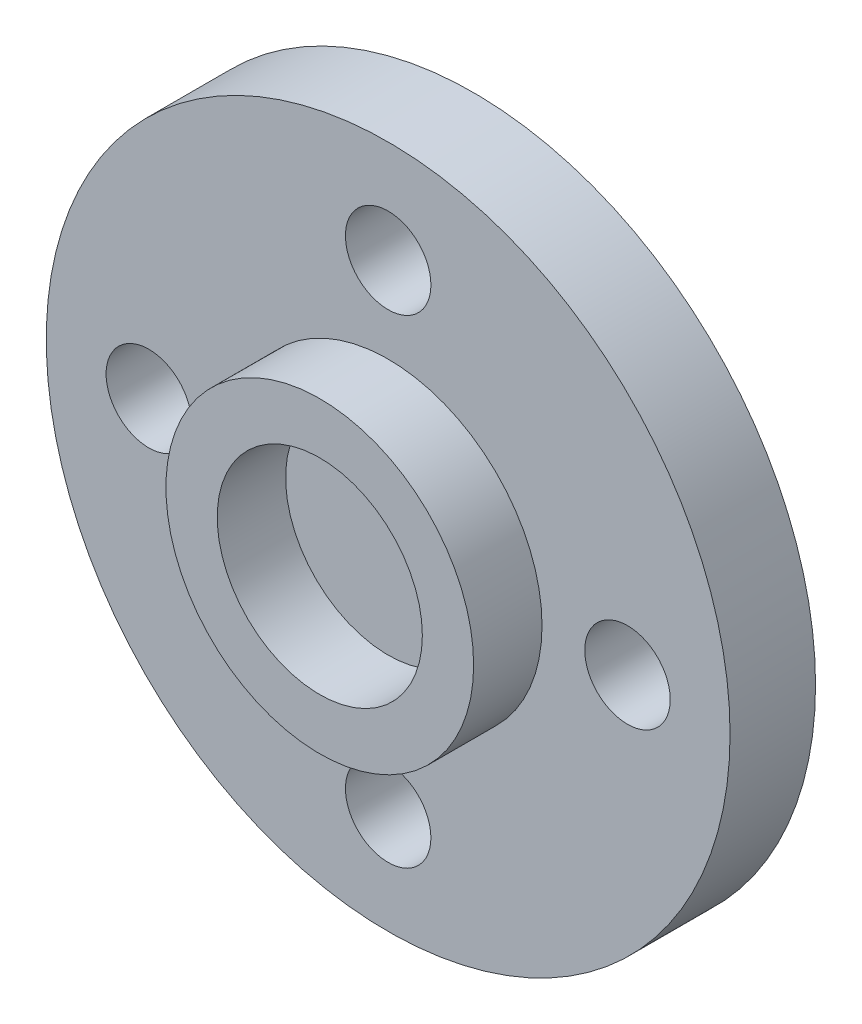
ISO-10303-21;
HEADER;
FILE_DESCRIPTION(('STEP AP214'),'2;1');
FILE_NAME('part.step','',(''),(''),'','','');
FILE_SCHEMA(('AUTOMOTIVE_DESIGN { 1 0 10303 214 1 1 1 1 }'));
ENDSEC;
DATA;
#1=APPLICATION_CONTEXT('core data for automotive mechanical design processes');
#2=APPLICATION_PROTOCOL_DEFINITION('international standard','automotive_design',2000,#1);
#3=PRODUCT_CONTEXT('',#1,'mechanical');
#4=PRODUCT('Part','Part','',(#3));
#5=PRODUCT_RELATED_PRODUCT_CATEGORY('part','',(#4));
#6=PRODUCT_DEFINITION_FORMATION('','',#4);
#7=PRODUCT_DEFINITION_CONTEXT('part definition',#1,'design');
#8=PRODUCT_DEFINITION('design','',#6,#7);
#9=PRODUCT_DEFINITION_SHAPE('','',#8);
#10=(LENGTH_UNIT() NAMED_UNIT(*) SI_UNIT(.MILLI.,.METRE.));
#11=(NAMED_UNIT(*) PLANE_ANGLE_UNIT() SI_UNIT($,.RADIAN.));
#12=(NAMED_UNIT(*) SI_UNIT($,.STERADIAN.) SOLID_ANGLE_UNIT());
#13=UNCERTAINTY_MEASURE_WITH_UNIT(LENGTH_MEASURE(1.E-05),#10,'distance_accuracy_value','');
#14=(GEOMETRIC_REPRESENTATION_CONTEXT(3) GLOBAL_UNCERTAINTY_ASSIGNED_CONTEXT((#13)) GLOBAL_UNIT_ASSIGNED_CONTEXT((#10,
#11,#12)) REPRESENTATION_CONTEXT('',''));
#15=CARTESIAN_POINT('',(0.,0.,0.));
#16=DIRECTION('',(0.,0.,1.));
#17=DIRECTION('',(1.,0.,0.));
#18=AXIS2_PLACEMENT_3D('',#15,#16,#17);
#19=CARTESIAN_POINT('',(0.,0.,2.5));
#20=DIRECTION('',(0.,0.,-1.));
#21=DIRECTION('',(-1.,0.,0.));
#22=AXIS2_PLACEMENT_3D('',#19,#20,#21);
#23=CYLINDRICAL_SURFACE('',#22,10.);
#24=CARTESIAN_POINT('',(0.,0.,2.5));
#25=DIRECTION('',(0.,0.,1.));
#26=DIRECTION('',(1.,0.,0.));
#27=AXIS2_PLACEMENT_3D('',#24,#25,#26);
#28=CIRCLE('',#27,10.);
#29=CARTESIAN_POINT('',(10.,0.,2.5));
#30=VERTEX_POINT('',#29);
#31=EDGE_CURVE('E50',#30,#30,#28,.T.);
#32=ORIENTED_EDGE('',*,*,#31,.F.);
#33=EDGE_LOOP('',(#32));
#34=FACE_BOUND('',#33,.T.);
#35=CARTESIAN_POINT('',(0.,0.,0.));
#36=DIRECTION('',(0.,0.,1.));
#37=DIRECTION('',(1.,0.,0.));
#38=AXIS2_PLACEMENT_3D('',#35,#36,#37);
#39=CIRCLE('',#38,10.);
#40=CARTESIAN_POINT('',(10.,0.,0.));
#41=VERTEX_POINT('',#40);
#42=EDGE_CURVE('E55',#41,#41,#39,.T.);
#43=ORIENTED_EDGE('',*,*,#42,.T.);
#44=EDGE_LOOP('',(#43));
#45=FACE_BOUND('',#44,.T.);
#46=ADVANCED_FACE('F43',(#34,#45),#23,.T.);
#47=CARTESIAN_POINT('',(0.,0.,2.5));
#48=DIRECTION('',(0.,0.,1.));
#49=DIRECTION('',(1.,0.,0.));
#50=AXIS2_PLACEMENT_3D('',#47,#48,#49);
#51=PLANE('',#50);
#52=CARTESIAN_POINT('',(0.,7.,2.5));
#53=DIRECTION('',(0.,0.,1.));
#54=DIRECTION('',(1.,0.,0.));
#55=AXIS2_PLACEMENT_3D('',#52,#53,#54);
#56=CIRCLE('',#55,1.25);
#57=CARTESIAN_POINT('',(1.25,7.,2.5));
#58=VERTEX_POINT('',#57);
#59=EDGE_CURVE('E99',#58,#58,#56,.T.);
#60=ORIENTED_EDGE('',*,*,#59,.F.);
#61=EDGE_LOOP('',(#60));
#62=FACE_BOUND('',#61,.T.);
#63=CARTESIAN_POINT('',(7.,0.,2.5));
#64=DIRECTION('',(0.,0.,1.));
#65=DIRECTION('',(1.,0.,0.));
#66=AXIS2_PLACEMENT_3D('',#63,#64,#65);
#67=CIRCLE('',#66,1.25);
#68=CARTESIAN_POINT('',(8.25,0.,2.5));
#69=VERTEX_POINT('',#68);
#70=EDGE_CURVE('E95',#69,#69,#67,.T.);
#71=ORIENTED_EDGE('',*,*,#70,.F.);
#72=EDGE_LOOP('',(#71));
#73=FACE_BOUND('',#72,.T.);
#74=CARTESIAN_POINT('',(0.,-7.,2.5));
#75=DIRECTION('',(0.,0.,1.));
#76=DIRECTION('',(1.,0.,0.));
#77=AXIS2_PLACEMENT_3D('',#74,#75,#76);
#78=CIRCLE('',#77,1.25);
#79=CARTESIAN_POINT('',(1.24999999999995,-7.,2.5));
#80=VERTEX_POINT('',#79);
#81=EDGE_CURVE('E87',#80,#80,#78,.T.);
#82=ORIENTED_EDGE('',*,*,#81,.F.);
#83=EDGE_LOOP('',(#82));
#84=FACE_BOUND('',#83,.T.);
#85=CARTESIAN_POINT('',(-7.,0.,2.5));
#86=DIRECTION('',(0.,0.,1.));
#87=DIRECTION('',(1.,0.,0.));
#88=AXIS2_PLACEMENT_3D('',#85,#86,#87);
#89=CIRCLE('',#88,1.25);
#90=CARTESIAN_POINT('',(-5.75,0.,2.5));
#91=VERTEX_POINT('',#90);
#92=EDGE_CURVE('E79',#91,#91,#89,.T.);
#93=ORIENTED_EDGE('',*,*,#92,.F.);
#94=EDGE_LOOP('',(#93));
#95=FACE_BOUND('',#94,.T.);
#96=CARTESIAN_POINT('',(0.,0.,2.5));
#97=DIRECTION('',(0.,0.,1.));
#98=DIRECTION('',(1.,0.,0.));
#99=AXIS2_PLACEMENT_3D('',#96,#97,#98);
#100=CIRCLE('',#99,4.5);
#101=CARTESIAN_POINT('',(4.5,0.,2.5));
#102=VERTEX_POINT('',#101);
#103=EDGE_CURVE('E63',#102,#102,#100,.T.);
#104=ORIENTED_EDGE('',*,*,#103,.F.);
#105=EDGE_LOOP('',(#104));
#106=FACE_BOUND('',#105,.T.);
#107=ORIENTED_EDGE('',*,*,#31,.T.);
#108=EDGE_LOOP('',(#107));
#109=FACE_BOUND('',#108,.T.);
#110=ADVANCED_FACE('F117',(#62,#73,#84,#95,#106,#109),#51,.T.);
#111=CARTESIAN_POINT('',(0.,0.,0.));
#112=DIRECTION('',(0.,0.,1.));
#113=DIRECTION('',(1.,0.,0.));
#114=AXIS2_PLACEMENT_3D('',#111,#112,#113);
#115=PLANE('',#114);
#116=CARTESIAN_POINT('',(0.,7.,0.));
#117=DIRECTION('',(0.,0.,1.));
#118=DIRECTION('',(1.,0.,0.));
#119=AXIS2_PLACEMENT_3D('',#116,#117,#118);
#120=CIRCLE('',#119,1.25);
#121=CARTESIAN_POINT('',(1.25,7.,0.));
#122=VERTEX_POINT('',#121);
#123=EDGE_CURVE('E74',#122,#122,#120,.T.);
#124=ORIENTED_EDGE('',*,*,#123,.T.);
#125=EDGE_LOOP('',(#124));
#126=FACE_BOUND('',#125,.T.);
#127=CARTESIAN_POINT('',(7.,0.,0.));
#128=DIRECTION('',(0.,0.,1.));
#129=DIRECTION('',(1.,0.,0.));
#130=AXIS2_PLACEMENT_3D('',#127,#128,#129);
#131=CIRCLE('',#130,1.25);
#132=CARTESIAN_POINT('',(8.25,0.,0.));
#133=VERTEX_POINT('',#132);
#134=EDGE_CURVE('E91',#133,#133,#131,.T.);
#135=ORIENTED_EDGE('',*,*,#134,.T.);
#136=EDGE_LOOP('',(#135));
#137=FACE_BOUND('',#136,.T.);
#138=CARTESIAN_POINT('',(0.,-7.,0.));
#139=DIRECTION('',(0.,0.,1.));
#140=DIRECTION('',(1.,0.,0.));
#141=AXIS2_PLACEMENT_3D('',#138,#139,#140);
#142=CIRCLE('',#141,1.25);
#143=CARTESIAN_POINT('',(1.24999999999995,-7.,0.));
#144=VERTEX_POINT('',#143);
#145=EDGE_CURVE('E83',#144,#144,#142,.T.);
#146=ORIENTED_EDGE('',*,*,#145,.T.);
#147=EDGE_LOOP('',(#146));
#148=FACE_BOUND('',#147,.T.);
#149=CARTESIAN_POINT('',(-7.,0.,0.));
#150=DIRECTION('',(0.,0.,1.));
#151=DIRECTION('',(1.,0.,0.));
#152=AXIS2_PLACEMENT_3D('',#149,#150,#151);
#153=CIRCLE('',#152,1.25);
#154=CARTESIAN_POINT('',(-5.75,0.,0.));
#155=VERTEX_POINT('',#154);
#156=EDGE_CURVE('E75',#155,#155,#153,.T.);
#157=ORIENTED_EDGE('',*,*,#156,.T.);
#158=EDGE_LOOP('',(#157));
#159=FACE_BOUND('',#158,.T.);
#160=ORIENTED_EDGE('',*,*,#42,.F.);
#161=EDGE_LOOP('',(#160));
#162=FACE_BOUND('',#161,.T.);
#163=ADVANCED_FACE('F107',(#126,#137,#148,#159,#162),#115,.F.);
#164=CARTESIAN_POINT('',(0.,0.,4.5));
#165=DIRECTION('',(0.,0.,1.));
#166=DIRECTION('',(1.,0.,0.));
#167=AXIS2_PLACEMENT_3D('',#164,#165,#166);
#168=PLANE('',#167);
#169=CARTESIAN_POINT('',(0.,0.,4.5));
#170=DIRECTION('',(0.,0.,1.));
#171=DIRECTION('',(1.,0.,0.));
#172=AXIS2_PLACEMENT_3D('',#169,#170,#171);
#173=CIRCLE('',#172,4.5);
#174=CARTESIAN_POINT('',(4.5,0.,4.5));
#175=VERTEX_POINT('',#174);
#176=EDGE_CURVE('E61',#175,#175,#173,.T.);
#177=ORIENTED_EDGE('',*,*,#176,.T.);
#178=EDGE_LOOP('',(#177));
#179=FACE_BOUND('',#178,.T.);
#180=CARTESIAN_POINT('',(0.,0.,4.5));
#181=DIRECTION('',(0.,0.,1.));
#182=DIRECTION('',(1.,0.,0.));
#183=AXIS2_PLACEMENT_3D('',#180,#181,#182);
#184=CIRCLE('',#183,3.);
#185=CARTESIAN_POINT('',(3.,0.,4.5));
#186=VERTEX_POINT('',#185);
#187=EDGE_CURVE('E67',#186,#186,#184,.T.);
#188=ORIENTED_EDGE('',*,*,#187,.F.);
#189=EDGE_LOOP('',(#188));
#190=FACE_BOUND('',#189,.T.);
#191=ADVANCED_FACE('F133',(#179,#190),#168,.T.);
#192=CARTESIAN_POINT('',(0.,0.,4.5));
#193=DIRECTION('',(0.,0.,-1.));
#194=DIRECTION('',(-1.,0.,0.));
#195=AXIS2_PLACEMENT_3D('',#192,#193,#194);
#196=CYLINDRICAL_SURFACE('',#195,4.5);
#197=ORIENTED_EDGE('',*,*,#176,.F.);
#198=EDGE_LOOP('',(#197));
#199=FACE_BOUND('',#198,.T.);
#200=ORIENTED_EDGE('',*,*,#103,.T.);
#201=EDGE_LOOP('',(#200));
#202=FACE_BOUND('',#201,.T.);
#203=ADVANCED_FACE('F130',(#199,#202),#196,.T.);
#204=CARTESIAN_POINT('',(0.,0.,4.5));
#205=DIRECTION('',(0.,0.,-1.));
#206=DIRECTION('',(-1.,0.,0.));
#207=AXIS2_PLACEMENT_3D('',#204,#205,#206);
#208=CYLINDRICAL_SURFACE('',#207,3.);
#209=ORIENTED_EDGE('',*,*,#187,.T.);
#210=EDGE_LOOP('',(#209));
#211=FACE_BOUND('',#210,.T.);
#212=CARTESIAN_POINT('',(0.,0.,2.5));
#213=DIRECTION('',(0.,0.,1.));
#214=DIRECTION('',(1.,0.,0.));
#215=AXIS2_PLACEMENT_3D('',#212,#213,#214);
#216=CIRCLE('',#215,3.);
#217=CARTESIAN_POINT('',(3.,0.,2.5));
#218=VERTEX_POINT('',#217);
#219=EDGE_CURVE('E10',#218,#218,#216,.F.);
#220=ORIENTED_EDGE('',*,*,#219,.T.);
#221=EDGE_LOOP('',(#220));
#222=FACE_BOUND('',#221,.T.);
#223=ADVANCED_FACE('F132',(#211,#222),#208,.F.);
#224=ORIENTED_EDGE('',*,*,#219,.F.);
#225=EDGE_LOOP('',(#224));
#226=FACE_BOUND('',#225,.T.);
#227=ADVANCED_FACE('F121',(#226),#51,.T.);
#228=CARTESIAN_POINT('',(-7.,0.,0.));
#229=DIRECTION('',(0.,0.,1.));
#230=DIRECTION('',(1.,0.,0.));
#231=AXIS2_PLACEMENT_3D('',#228,#229,#230);
#232=CYLINDRICAL_SURFACE('',#231,1.25);
#233=ORIENTED_EDGE('',*,*,#156,.F.);
#234=EDGE_LOOP('',(#233));
#235=FACE_BOUND('',#234,.T.);
#236=ORIENTED_EDGE('',*,*,#92,.T.);
#237=EDGE_LOOP('',(#236));
#238=FACE_BOUND('',#237,.T.);
#239=ADVANCED_FACE('F163',(#235,#238),#232,.F.);
#240=CARTESIAN_POINT('',(0.,-7.,0.));
#241=DIRECTION('',(0.,0.,1.));
#242=DIRECTION('',(1.,0.,0.));
#243=AXIS2_PLACEMENT_3D('',#240,#241,#242);
#244=CYLINDRICAL_SURFACE('',#243,1.25);
#245=ORIENTED_EDGE('',*,*,#145,.F.);
#246=EDGE_LOOP('',(#245));
#247=FACE_BOUND('',#246,.T.);
#248=ORIENTED_EDGE('',*,*,#81,.T.);
#249=EDGE_LOOP('',(#248));
#250=FACE_BOUND('',#249,.T.);
#251=ADVANCED_FACE('F167',(#247,#250),#244,.F.);
#252=CARTESIAN_POINT('',(7.,0.,0.));
#253=DIRECTION('',(0.,0.,1.));
#254=DIRECTION('',(1.,0.,0.));
#255=AXIS2_PLACEMENT_3D('',#252,#253,#254);
#256=CYLINDRICAL_SURFACE('',#255,1.25);
#257=ORIENTED_EDGE('',*,*,#134,.F.);
#258=EDGE_LOOP('',(#257));
#259=FACE_BOUND('',#258,.T.);
#260=ORIENTED_EDGE('',*,*,#70,.T.);
#261=EDGE_LOOP('',(#260));
#262=FACE_BOUND('',#261,.T.);
#263=ADVANCED_FACE('F113',(#259,#262),#256,.F.);
#264=CARTESIAN_POINT('',(0.,7.,0.));
#265=DIRECTION('',(0.,0.,1.));
#266=DIRECTION('',(1.,0.,0.));
#267=AXIS2_PLACEMENT_3D('',#264,#265,#266);
#268=CYLINDRICAL_SURFACE('',#267,1.25);
#269=ORIENTED_EDGE('',*,*,#123,.F.);
#270=EDGE_LOOP('',(#269));
#271=FACE_BOUND('',#270,.T.);
#272=ORIENTED_EDGE('',*,*,#59,.T.);
#273=EDGE_LOOP('',(#272));
#274=FACE_BOUND('',#273,.T.);
#275=ADVANCED_FACE('F110',(#271,#274),#268,.F.);
#276=CLOSED_SHELL('',(#46,#110,#163,#191,#203,#223,#227,#239,#251,#263,#275));
#277=MANIFOLD_SOLID_BREP('B2',#276);
#278=ADVANCED_BREP_SHAPE_REPRESENTATION('',(#18,#277),#14);
#279=SHAPE_DEFINITION_REPRESENTATION(#9,#278);
ENDSEC;
END-ISO-10303-21;
